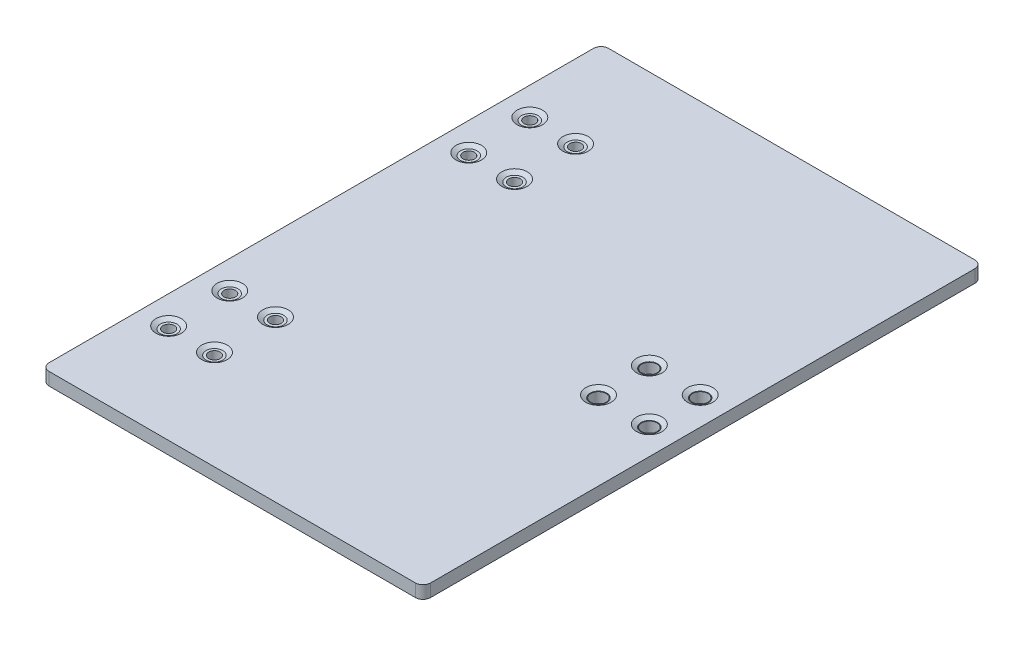
ISO-10303-21;
HEADER;
FILE_DESCRIPTION(('STEP AP214'),'2;1');
FILE_NAME('part.step','',(''),(''),'','','');
FILE_SCHEMA(('AUTOMOTIVE_DESIGN { 1 0 10303 214 1 1 1 1 }'));
ENDSEC;
DATA;
#1=APPLICATION_CONTEXT('core data for automotive mechanical design processes');
#2=APPLICATION_PROTOCOL_DEFINITION('international standard','automotive_design',2000,#1);
#3=PRODUCT_CONTEXT('',#1,'mechanical');
#4=PRODUCT('Part','Part','',(#3));
#5=PRODUCT_RELATED_PRODUCT_CATEGORY('part','',(#4));
#6=PRODUCT_DEFINITION_FORMATION('','',#4);
#7=PRODUCT_DEFINITION_CONTEXT('part definition',#1,'design');
#8=PRODUCT_DEFINITION('design','',#6,#7);
#9=PRODUCT_DEFINITION_SHAPE('','',#8);
#10=(LENGTH_UNIT() NAMED_UNIT(*) SI_UNIT(.MILLI.,.METRE.));
#11=(NAMED_UNIT(*) PLANE_ANGLE_UNIT() SI_UNIT($,.RADIAN.));
#12=(NAMED_UNIT(*) SI_UNIT($,.STERADIAN.) SOLID_ANGLE_UNIT());
#13=UNCERTAINTY_MEASURE_WITH_UNIT(LENGTH_MEASURE(1.E-05),#10,'distance_accuracy_value','');
#14=(GEOMETRIC_REPRESENTATION_CONTEXT(3) GLOBAL_UNCERTAINTY_ASSIGNED_CONTEXT((#13)) GLOBAL_UNIT_ASSIGNED_CONTEXT((#10,
#11,#12)) REPRESENTATION_CONTEXT('',''));
#15=CARTESIAN_POINT('',(0.,0.,0.));
#16=DIRECTION('',(0.,0.,1.));
#17=DIRECTION('',(1.,0.,0.));
#18=AXIS2_PLACEMENT_3D('',#15,#16,#17);
#19=CARTESIAN_POINT('',(11.,-10.,-156.999999999996));
#20=DIRECTION('',(0.,1.,0.));
#21=DIRECTION('',(0.,0.,1.));
#22=AXIS2_PLACEMENT_3D('',#19,#20,#21);
#23=CYLINDRICAL_SURFACE('',#22,2.25);
#24=CARTESIAN_POINT('',(11.,-5.,-156.999999999996));
#25=DIRECTION('',(0.,1.,0.));
#26=DIRECTION('',(0.,0.,1.));
#27=AXIS2_PLACEMENT_3D('',#24,#25,#26);
#28=CIRCLE('',#27,2.25);
#29=CARTESIAN_POINT('',(11.,-5.,-154.749999999996));
#30=VERTEX_POINT('',#29);
#31=EDGE_CURVE('E211',#30,#30,#28,.T.);
#32=ORIENTED_EDGE('',*,*,#31,.F.);
#33=EDGE_LOOP('',(#32));
#34=FACE_BOUND('',#33,.T.);
#35=CARTESIAN_POINT('',(11.,-0.999999999999999,-156.999999999996));
#36=DIRECTION('',(0.,1.,0.));
#37=DIRECTION('',(0.,0.,1.));
#38=AXIS2_PLACEMENT_3D('',#35,#36,#37);
#39=CIRCLE('',#38,2.25);
#40=CARTESIAN_POINT('',(11.,-0.999999999999999,-154.749999999996));
#41=VERTEX_POINT('',#40);
#42=EDGE_CURVE('E139',#41,#41,#39,.F.);
#43=ORIENTED_EDGE('',*,*,#42,.F.);
#44=EDGE_LOOP('',(#43));
#45=FACE_BOUND('',#44,.T.);
#46=ADVANCED_FACE('F38',(#34,#45),#23,.F.);
#47=CARTESIAN_POINT('',(139.,-10.,-120.));
#48=DIRECTION('',(0.,1.,0.));
#49=DIRECTION('',(0.,0.,1.));
#50=AXIS2_PLACEMENT_3D('',#47,#48,#49);
#51=CYLINDRICAL_SURFACE('',#50,2.99999999999999);
#52=CARTESIAN_POINT('',(139.,-5.,-120.));
#53=DIRECTION('',(0.,1.,0.));
#54=DIRECTION('',(0.,0.,1.));
#55=AXIS2_PLACEMENT_3D('',#52,#53,#54);
#56=CIRCLE('',#55,2.99999999999999);
#57=CARTESIAN_POINT('',(139.,-5.,-117.));
#58=VERTEX_POINT('',#57);
#59=EDGE_CURVE('E215',#58,#58,#56,.T.);
#60=ORIENTED_EDGE('',*,*,#59,.F.);
#61=EDGE_LOOP('',(#60));
#62=FACE_BOUND('',#61,.T.);
#63=CARTESIAN_POINT('',(139.,-0.999999999999999,-120.));
#64=DIRECTION('',(0.,1.,0.));
#65=DIRECTION('',(0.,0.,1.));
#66=AXIS2_PLACEMENT_3D('',#63,#64,#65);
#67=CIRCLE('',#66,2.99999999999999);
#68=CARTESIAN_POINT('',(139.,-0.999999999999999,-117.));
#69=VERTEX_POINT('',#68);
#70=EDGE_CURVE('E206',#69,#69,#67,.F.);
#71=ORIENTED_EDGE('',*,*,#70,.F.);
#72=EDGE_LOOP('',(#71));
#73=FACE_BOUND('',#72,.T.);
#74=ADVANCED_FACE('F270',(#62,#73),#51,.F.);
#75=CARTESIAN_POINT('',(119.,-10.,-100.));
#76=DIRECTION('',(0.,1.,0.));
#77=DIRECTION('',(0.,0.,1.));
#78=AXIS2_PLACEMENT_3D('',#75,#76,#77);
#79=CYLINDRICAL_SURFACE('',#78,3.00000000000001);
#80=CARTESIAN_POINT('',(119.,-5.,-100.));
#81=DIRECTION('',(0.,1.,0.));
#82=DIRECTION('',(0.,0.,1.));
#83=AXIS2_PLACEMENT_3D('',#80,#81,#82);
#84=CIRCLE('',#83,3.00000000000001);
#85=CARTESIAN_POINT('',(119.,-5.,-97.));
#86=VERTEX_POINT('',#85);
#87=EDGE_CURVE('E220',#86,#86,#84,.T.);
#88=ORIENTED_EDGE('',*,*,#87,.F.);
#89=EDGE_LOOP('',(#88));
#90=FACE_BOUND('',#89,.T.);
#91=CARTESIAN_POINT('',(119.,-0.999999999999999,-100.));
#92=DIRECTION('',(0.,1.,0.));
#93=DIRECTION('',(0.,0.,1.));
#94=AXIS2_PLACEMENT_3D('',#91,#92,#93);
#95=CIRCLE('',#94,3.00000000000001);
#96=CARTESIAN_POINT('',(119.,-0.999999999999999,-97.));
#97=VERTEX_POINT('',#96);
#98=EDGE_CURVE('E204',#97,#97,#95,.F.);
#99=ORIENTED_EDGE('',*,*,#98,.F.);
#100=EDGE_LOOP('',(#99));
#101=FACE_BOUND('',#100,.T.);
#102=ADVANCED_FACE('F276',(#90,#101),#79,.F.);
#103=CARTESIAN_POINT('',(139.,-10.,-100.));
#104=DIRECTION('',(0.,1.,0.));
#105=DIRECTION('',(0.,0.,1.));
#106=AXIS2_PLACEMENT_3D('',#103,#104,#105);
#107=CYLINDRICAL_SURFACE('',#106,2.99999999999999);
#108=CARTESIAN_POINT('',(139.,-5.,-100.));
#109=DIRECTION('',(0.,1.,0.));
#110=DIRECTION('',(0.,0.,1.));
#111=AXIS2_PLACEMENT_3D('',#108,#109,#110);
#112=CIRCLE('',#111,2.99999999999999);
#113=CARTESIAN_POINT('',(139.,-5.,-97.));
#114=VERTEX_POINT('',#113);
#115=EDGE_CURVE('E227',#114,#114,#112,.T.);
#116=ORIENTED_EDGE('',*,*,#115,.F.);
#117=EDGE_LOOP('',(#116));
#118=FACE_BOUND('',#117,.T.);
#119=CARTESIAN_POINT('',(139.,-0.999999999999999,-100.));
#120=DIRECTION('',(0.,1.,0.));
#121=DIRECTION('',(0.,0.,1.));
#122=AXIS2_PLACEMENT_3D('',#119,#120,#121);
#123=CIRCLE('',#122,2.99999999999999);
#124=CARTESIAN_POINT('',(139.,-0.999999999999999,-97.));
#125=VERTEX_POINT('',#124);
#126=EDGE_CURVE('E201',#125,#125,#123,.F.);
#127=ORIENTED_EDGE('',*,*,#126,.F.);
#128=EDGE_LOOP('',(#127));
#129=FACE_BOUND('',#128,.T.);
#130=ADVANCED_FACE('F560',(#118,#129),#107,.F.);
#131=CARTESIAN_POINT('',(11.,-10.,-63.));
#132=DIRECTION('',(0.,1.,0.));
#133=DIRECTION('',(0.,0.,1.));
#134=AXIS2_PLACEMENT_3D('',#131,#132,#133);
#135=CYLINDRICAL_SURFACE('',#134,2.25);
#136=CARTESIAN_POINT('',(11.,-5.,-63.));
#137=DIRECTION('',(0.,1.,0.));
#138=DIRECTION('',(0.,0.,1.));
#139=AXIS2_PLACEMENT_3D('',#136,#137,#138);
#140=CIRCLE('',#139,2.25);
#141=CARTESIAN_POINT('',(11.,-5.,-60.75));
#142=VERTEX_POINT('',#141);
#143=EDGE_CURVE('E230',#142,#142,#140,.T.);
#144=ORIENTED_EDGE('',*,*,#143,.F.);
#145=EDGE_LOOP('',(#144));
#146=FACE_BOUND('',#145,.T.);
#147=CARTESIAN_POINT('',(11.,-0.999999999999999,-63.));
#148=DIRECTION('',(0.,1.,0.));
#149=DIRECTION('',(0.,0.,1.));
#150=AXIS2_PLACEMENT_3D('',#147,#148,#149);
#151=CIRCLE('',#150,2.25);
#152=CARTESIAN_POINT('',(11.,-0.999999999999999,-60.75));
#153=VERTEX_POINT('',#152);
#154=EDGE_CURVE('E198',#153,#153,#151,.F.);
#155=ORIENTED_EDGE('',*,*,#154,.F.);
#156=EDGE_LOOP('',(#155));
#157=FACE_BOUND('',#156,.T.);
#158=ADVANCED_FACE('F569',(#146,#157),#135,.F.);
#159=CARTESIAN_POINT('',(29.,-10.,-180.999999999996));
#160=DIRECTION('',(0.,1.,0.));
#161=DIRECTION('',(0.,0.,1.));
#162=AXIS2_PLACEMENT_3D('',#159,#160,#161);
#163=CYLINDRICAL_SURFACE('',#162,2.25);
#164=CARTESIAN_POINT('',(29.,-5.,-180.999999999996));
#165=DIRECTION('',(0.,1.,0.));
#166=DIRECTION('',(0.,0.,1.));
#167=AXIS2_PLACEMENT_3D('',#164,#165,#166);
#168=CIRCLE('',#167,2.25);
#169=CARTESIAN_POINT('',(29.,-5.,-178.749999999996));
#170=VERTEX_POINT('',#169);
#171=EDGE_CURVE('E233',#170,#170,#168,.T.);
#172=ORIENTED_EDGE('',*,*,#171,.F.);
#173=EDGE_LOOP('',(#172));
#174=FACE_BOUND('',#173,.T.);
#175=CARTESIAN_POINT('',(29.,-0.999999999999999,-180.999999999996));
#176=DIRECTION('',(0.,1.,0.));
#177=DIRECTION('',(0.,0.,1.));
#178=AXIS2_PLACEMENT_3D('',#175,#176,#177);
#179=CIRCLE('',#178,2.25);
#180=CARTESIAN_POINT('',(29.,-0.999999999999999,-178.749999999996));
#181=VERTEX_POINT('',#180);
#182=EDGE_CURVE('E195',#181,#181,#179,.F.);
#183=ORIENTED_EDGE('',*,*,#182,.F.);
#184=EDGE_LOOP('',(#183));
#185=FACE_BOUND('',#184,.T.);
#186=ADVANCED_FACE('F578',(#174,#185),#163,.F.);
#187=CARTESIAN_POINT('',(29.,-10.,-156.999999999996));
#188=DIRECTION('',(0.,1.,0.));
#189=DIRECTION('',(0.,0.,1.));
#190=AXIS2_PLACEMENT_3D('',#187,#188,#189);
#191=CYLINDRICAL_SURFACE('',#190,2.25);
#192=CARTESIAN_POINT('',(29.,-5.,-156.999999999996));
#193=DIRECTION('',(0.,1.,0.));
#194=DIRECTION('',(0.,0.,1.));
#195=AXIS2_PLACEMENT_3D('',#192,#193,#194);
#196=CIRCLE('',#195,2.25);
#197=CARTESIAN_POINT('',(29.,-5.,-154.749999999996));
#198=VERTEX_POINT('',#197);
#199=EDGE_CURVE('E236',#198,#198,#196,.T.);
#200=ORIENTED_EDGE('',*,*,#199,.F.);
#201=EDGE_LOOP('',(#200));
#202=FACE_BOUND('',#201,.T.);
#203=CARTESIAN_POINT('',(29.,-0.999999999999999,-156.999999999996));
#204=DIRECTION('',(0.,1.,0.));
#205=DIRECTION('',(0.,0.,1.));
#206=AXIS2_PLACEMENT_3D('',#203,#204,#205);
#207=CIRCLE('',#206,2.25);
#208=CARTESIAN_POINT('',(29.,-0.999999999999999,-154.749999999996));
#209=VERTEX_POINT('',#208);
#210=EDGE_CURVE('E192',#209,#209,#207,.F.);
#211=ORIENTED_EDGE('',*,*,#210,.F.);
#212=EDGE_LOOP('',(#211));
#213=FACE_BOUND('',#212,.T.);
#214=ADVANCED_FACE('F282',(#202,#213),#191,.F.);
#215=CARTESIAN_POINT('',(11.,-10.,-180.999999999996));
#216=DIRECTION('',(0.,1.,0.));
#217=DIRECTION('',(0.,0.,1.));
#218=AXIS2_PLACEMENT_3D('',#215,#216,#217);
#219=CYLINDRICAL_SURFACE('',#218,2.25);
#220=CARTESIAN_POINT('',(11.,-5.,-180.999999999996));
#221=DIRECTION('',(0.,1.,0.));
#222=DIRECTION('',(0.,0.,1.));
#223=AXIS2_PLACEMENT_3D('',#220,#221,#222);
#224=CIRCLE('',#223,2.25);
#225=CARTESIAN_POINT('',(11.,-5.,-178.749999999996));
#226=VERTEX_POINT('',#225);
#227=EDGE_CURVE('E239',#226,#226,#224,.T.);
#228=ORIENTED_EDGE('',*,*,#227,.F.);
#229=EDGE_LOOP('',(#228));
#230=FACE_BOUND('',#229,.T.);
#231=CARTESIAN_POINT('',(11.,-0.999999999999999,-180.999999999996));
#232=DIRECTION('',(0.,1.,0.));
#233=DIRECTION('',(0.,0.,1.));
#234=AXIS2_PLACEMENT_3D('',#231,#232,#233);
#235=CIRCLE('',#234,2.25);
#236=CARTESIAN_POINT('',(11.,-0.999999999999999,-178.749999999996));
#237=VERTEX_POINT('',#236);
#238=EDGE_CURVE('E189',#237,#237,#235,.F.);
#239=ORIENTED_EDGE('',*,*,#238,.F.);
#240=EDGE_LOOP('',(#239));
#241=FACE_BOUND('',#240,.T.);
#242=ADVANCED_FACE('F595',(#230,#241),#219,.F.);
#243=CARTESIAN_POINT('',(119.,-10.,-120.));
#244=DIRECTION('',(0.,1.,0.));
#245=DIRECTION('',(0.,0.,1.));
#246=AXIS2_PLACEMENT_3D('',#243,#244,#245);
#247=CYLINDRICAL_SURFACE('',#246,3.00000000000001);
#248=CARTESIAN_POINT('',(119.,-5.,-120.));
#249=DIRECTION('',(0.,1.,0.));
#250=DIRECTION('',(0.,0.,1.));
#251=AXIS2_PLACEMENT_3D('',#248,#249,#250);
#252=CIRCLE('',#251,3.00000000000001);
#253=CARTESIAN_POINT('',(119.,-5.,-117.));
#254=VERTEX_POINT('',#253);
#255=EDGE_CURVE('E242',#254,#254,#252,.T.);
#256=ORIENTED_EDGE('',*,*,#255,.F.);
#257=EDGE_LOOP('',(#256));
#258=FACE_BOUND('',#257,.T.);
#259=CARTESIAN_POINT('',(119.,-0.999999999999999,-120.));
#260=DIRECTION('',(0.,1.,0.));
#261=DIRECTION('',(0.,0.,1.));
#262=AXIS2_PLACEMENT_3D('',#259,#260,#261);
#263=CIRCLE('',#262,3.00000000000001);
#264=CARTESIAN_POINT('',(119.,-0.999999999999999,-117.));
#265=VERTEX_POINT('',#264);
#266=EDGE_CURVE('E186',#265,#265,#263,.F.);
#267=ORIENTED_EDGE('',*,*,#266,.F.);
#268=EDGE_LOOP('',(#267));
#269=FACE_BOUND('',#268,.T.);
#270=ADVANCED_FACE('F603',(#258,#269),#247,.F.);
#271=CARTESIAN_POINT('',(29.,-10.,-39.));
#272=DIRECTION('',(0.,1.,0.));
#273=DIRECTION('',(0.,0.,1.));
#274=AXIS2_PLACEMENT_3D('',#271,#272,#273);
#275=CYLINDRICAL_SURFACE('',#274,2.25);
#276=CARTESIAN_POINT('',(29.,-5.,-39.));
#277=DIRECTION('',(0.,1.,0.));
#278=DIRECTION('',(0.,0.,1.));
#279=AXIS2_PLACEMENT_3D('',#276,#277,#278);
#280=CIRCLE('',#279,2.25);
#281=CARTESIAN_POINT('',(29.,-5.,-36.75));
#282=VERTEX_POINT('',#281);
#283=EDGE_CURVE('E245',#282,#282,#280,.T.);
#284=ORIENTED_EDGE('',*,*,#283,.F.);
#285=EDGE_LOOP('',(#284));
#286=FACE_BOUND('',#285,.T.);
#287=CARTESIAN_POINT('',(29.,-0.999999999999999,-39.));
#288=DIRECTION('',(0.,1.,0.));
#289=DIRECTION('',(0.,0.,1.));
#290=AXIS2_PLACEMENT_3D('',#287,#288,#289);
#291=CIRCLE('',#290,2.25);
#292=CARTESIAN_POINT('',(29.,-0.999999999999999,-36.75));
#293=VERTEX_POINT('',#292);
#294=EDGE_CURVE('E183',#293,#293,#291,.F.);
#295=ORIENTED_EDGE('',*,*,#294,.F.);
#296=EDGE_LOOP('',(#295));
#297=FACE_BOUND('',#296,.T.);
#298=ADVANCED_FACE('F611',(#286,#297),#275,.F.);
#299=CARTESIAN_POINT('',(11.,-10.,-39.));
#300=DIRECTION('',(0.,1.,0.));
#301=DIRECTION('',(0.,0.,1.));
#302=AXIS2_PLACEMENT_3D('',#299,#300,#301);
#303=CYLINDRICAL_SURFACE('',#302,2.25);
#304=CARTESIAN_POINT('',(11.,-5.,-39.));
#305=DIRECTION('',(0.,1.,0.));
#306=DIRECTION('',(0.,0.,1.));
#307=AXIS2_PLACEMENT_3D('',#304,#305,#306);
#308=CIRCLE('',#307,2.25);
#309=CARTESIAN_POINT('',(11.,-5.,-36.75));
#310=VERTEX_POINT('',#309);
#311=EDGE_CURVE('E248',#310,#310,#308,.T.);
#312=ORIENTED_EDGE('',*,*,#311,.F.);
#313=EDGE_LOOP('',(#312));
#314=FACE_BOUND('',#313,.T.);
#315=CARTESIAN_POINT('',(11.,-0.999999999999999,-39.));
#316=DIRECTION('',(0.,1.,0.));
#317=DIRECTION('',(0.,0.,1.));
#318=AXIS2_PLACEMENT_3D('',#315,#316,#317);
#319=CIRCLE('',#318,2.25);
#320=CARTESIAN_POINT('',(11.,-0.999999999999999,-36.75));
#321=VERTEX_POINT('',#320);
#322=EDGE_CURVE('E179',#321,#321,#319,.F.);
#323=ORIENTED_EDGE('',*,*,#322,.F.);
#324=EDGE_LOOP('',(#323));
#325=FACE_BOUND('',#324,.T.);
#326=ADVANCED_FACE('F620',(#314,#325),#303,.F.);
#327=CARTESIAN_POINT('',(29.,-10.,-63.));
#328=DIRECTION('',(0.,1.,0.));
#329=DIRECTION('',(0.,0.,1.));
#330=AXIS2_PLACEMENT_3D('',#327,#328,#329);
#331=CYLINDRICAL_SURFACE('',#330,2.25);
#332=CARTESIAN_POINT('',(29.,-5.,-63.));
#333=DIRECTION('',(0.,1.,0.));
#334=DIRECTION('',(0.,0.,1.));
#335=AXIS2_PLACEMENT_3D('',#332,#333,#334);
#336=CIRCLE('',#335,2.25);
#337=CARTESIAN_POINT('',(29.,-5.,-60.75));
#338=VERTEX_POINT('',#337);
#339=EDGE_CURVE('E126',#338,#338,#336,.T.);
#340=ORIENTED_EDGE('',*,*,#339,.F.);
#341=EDGE_LOOP('',(#340));
#342=FACE_BOUND('',#341,.T.);
#343=CARTESIAN_POINT('',(29.,-0.999999999999999,-63.));
#344=DIRECTION('',(0.,1.,0.));
#345=DIRECTION('',(0.,0.,1.));
#346=AXIS2_PLACEMENT_3D('',#343,#344,#345);
#347=CIRCLE('',#346,2.25);
#348=CARTESIAN_POINT('',(29.,-0.999999999999999,-60.75));
#349=VERTEX_POINT('',#348);
#350=EDGE_CURVE('E176',#349,#349,#347,.F.);
#351=ORIENTED_EDGE('',*,*,#350,.F.);
#352=EDGE_LOOP('',(#351));
#353=FACE_BOUND('',#352,.T.);
#354=ADVANCED_FACE('F299',(#342,#353),#331,.F.);
#355=CARTESIAN_POINT('',(150.,-5.,-220.));
#356=DIRECTION('',(0.,0.,-1.));
#357=DIRECTION('',(-1.,0.,0.));
#358=AXIS2_PLACEMENT_3D('',#355,#356,#357);
#359=PLANE('',#358);
#360=DIRECTION('',(-1.,0.,0.));
#361=VECTOR('',#360,1.);
#362=CARTESIAN_POINT('',(150.,-5.,-220.));
#363=LINE('',#362,#361);
#364=CARTESIAN_POINT('',(147.,-5.,-220.));
#365=VERTEX_POINT('',#364);
#366=CARTESIAN_POINT('',(2.99999999999998,-5.,-220.));
#367=VERTEX_POINT('',#366);
#368=EDGE_CURVE('E172',#365,#367,#363,.T.);
#369=ORIENTED_EDGE('',*,*,#368,.T.);
#370=DIRECTION('',(0.,1.,0.));
#371=VECTOR('',#370,1.);
#372=CARTESIAN_POINT('',(2.99999999999998,-5.,-220.));
#373=LINE('',#372,#371);
#374=CARTESIAN_POINT('',(2.99999999999998,0.,-220.));
#375=VERTEX_POINT('',#374);
#376=EDGE_CURVE('E124',#367,#375,#373,.T.);
#377=ORIENTED_EDGE('',*,*,#376,.T.);
#378=DIRECTION('',(-1.,0.,0.));
#379=VECTOR('',#378,1.);
#380=CARTESIAN_POINT('',(150.,0.,-220.));
#381=LINE('',#380,#379);
#382=CARTESIAN_POINT('',(147.,0.,-220.));
#383=VERTEX_POINT('',#382);
#384=EDGE_CURVE('E107',#383,#375,#381,.T.);
#385=ORIENTED_EDGE('',*,*,#384,.F.);
#386=DIRECTION('',(0.,1.,0.));
#387=VECTOR('',#386,1.);
#388=CARTESIAN_POINT('',(147.,-5.,-220.));
#389=LINE('',#388,#387);
#390=EDGE_CURVE('E121',#383,#365,#389,.F.);
#391=ORIENTED_EDGE('',*,*,#390,.T.);
#392=EDGE_LOOP('',(#369,#377,#385,#391));
#393=FACE_BOUND('',#392,.T.);
#394=ADVANCED_FACE('F120',(#393),#359,.T.);
#395=CARTESIAN_POINT('',(150.,-5.,0.));
#396=DIRECTION('',(1.,0.,0.));
#397=DIRECTION('',(0.,0.,-1.));
#398=AXIS2_PLACEMENT_3D('',#395,#396,#397);
#399=PLANE('',#398);
#400=DIRECTION('',(0.,0.,-1.));
#401=VECTOR('',#400,1.);
#402=CARTESIAN_POINT('',(150.,-5.,0.));
#403=LINE('',#402,#401);
#404=CARTESIAN_POINT('',(150.,-5.,-3.));
#405=VERTEX_POINT('',#404);
#406=CARTESIAN_POINT('',(150.,-5.,-217.));
#407=VERTEX_POINT('',#406);
#408=EDGE_CURVE('E131',#405,#407,#403,.T.);
#409=ORIENTED_EDGE('',*,*,#408,.T.);
#410=DIRECTION('',(0.,1.,0.));
#411=VECTOR('',#410,1.);
#412=CARTESIAN_POINT('',(150.,-5.,-217.));
#413=LINE('',#412,#411);
#414=CARTESIAN_POINT('',(150.,0.,-217.));
#415=VERTEX_POINT('',#414);
#416=EDGE_CURVE('E158',#407,#415,#413,.T.);
#417=ORIENTED_EDGE('',*,*,#416,.T.);
#418=DIRECTION('',(0.,0.,-1.));
#419=VECTOR('',#418,1.);
#420=CARTESIAN_POINT('',(150.,0.,0.));
#421=LINE('',#420,#419);
#422=CARTESIAN_POINT('',(150.,0.,-3.));
#423=VERTEX_POINT('',#422);
#424=EDGE_CURVE('E109',#423,#415,#421,.T.);
#425=ORIENTED_EDGE('',*,*,#424,.F.);
#426=DIRECTION('',(0.,1.,0.));
#427=VECTOR('',#426,1.);
#428=CARTESIAN_POINT('',(150.,-5.,-3.));
#429=LINE('',#428,#427);
#430=EDGE_CURVE('E156',#423,#405,#429,.F.);
#431=ORIENTED_EDGE('',*,*,#430,.T.);
#432=EDGE_LOOP('',(#409,#417,#425,#431));
#433=FACE_BOUND('',#432,.T.);
#434=ADVANCED_FACE('F160',(#433),#399,.T.);
#435=CARTESIAN_POINT('',(0.,-5.,0.));
#436=DIRECTION('',(0.,0.,1.));
#437=DIRECTION('',(1.,0.,0.));
#438=AXIS2_PLACEMENT_3D('',#435,#436,#437);
#439=PLANE('',#438);
#440=DIRECTION('',(1.,0.,0.));
#441=VECTOR('',#440,1.);
#442=CARTESIAN_POINT('',(0.,-5.,0.));
#443=LINE('',#442,#441);
#444=CARTESIAN_POINT('',(3.,-5.,0.));
#445=VERTEX_POINT('',#444);
#446=CARTESIAN_POINT('',(147.,-5.,0.));
#447=VERTEX_POINT('',#446);
#448=EDGE_CURVE('E136',#445,#447,#443,.T.);
#449=ORIENTED_EDGE('',*,*,#448,.T.);
#450=DIRECTION('',(0.,1.,0.));
#451=VECTOR('',#450,1.);
#452=CARTESIAN_POINT('',(147.,-5.,0.));
#453=LINE('',#452,#451);
#454=CARTESIAN_POINT('',(147.,0.,0.));
#455=VERTEX_POINT('',#454);
#456=EDGE_CURVE('E11',#447,#455,#453,.T.);
#457=ORIENTED_EDGE('',*,*,#456,.T.);
#458=DIRECTION('',(1.,0.,0.));
#459=VECTOR('',#458,1.);
#460=CARTESIAN_POINT('',(0.,0.,0.));
#461=LINE('',#460,#459);
#462=CARTESIAN_POINT('',(3.,0.,0.));
#463=VERTEX_POINT('',#462);
#464=EDGE_CURVE('E169',#463,#455,#461,.T.);
#465=ORIENTED_EDGE('',*,*,#464,.F.);
#466=DIRECTION('',(0.,1.,0.));
#467=VECTOR('',#466,1.);
#468=CARTESIAN_POINT('',(3.,-5.,0.));
#469=LINE('',#468,#467);
#470=EDGE_CURVE('E46',#463,#445,#469,.F.);
#471=ORIENTED_EDGE('',*,*,#470,.T.);
#472=EDGE_LOOP('',(#449,#457,#465,#471));
#473=FACE_BOUND('',#472,.T.);
#474=ADVANCED_FACE('F168',(#473),#439,.T.);
#475=CARTESIAN_POINT('',(0.,-5.,-220.));
#476=DIRECTION('',(-1.,0.,0.));
#477=DIRECTION('',(0.,0.,1.));
#478=AXIS2_PLACEMENT_3D('',#475,#476,#477);
#479=PLANE('',#478);
#480=DIRECTION('',(0.,0.,1.));
#481=VECTOR('',#480,1.);
#482=CARTESIAN_POINT('',(0.,0.,-220.));
#483=LINE('',#482,#481);
#484=CARTESIAN_POINT('',(0.,0.,-217.));
#485=VERTEX_POINT('',#484);
#486=CARTESIAN_POINT('',(0.,0.,-3.));
#487=VERTEX_POINT('',#486);
#488=EDGE_CURVE('E125',#485,#487,#483,.T.);
#489=ORIENTED_EDGE('',*,*,#488,.F.);
#490=DIRECTION('',(0.,1.,0.));
#491=VECTOR('',#490,1.);
#492=CARTESIAN_POINT('',(0.,-5.,-217.));
#493=LINE('',#492,#491);
#494=CARTESIAN_POINT('',(0.,-5.,-217.));
#495=VERTEX_POINT('',#494);
#496=EDGE_CURVE('E148',#485,#495,#493,.F.);
#497=ORIENTED_EDGE('',*,*,#496,.T.);
#498=DIRECTION('',(0.,0.,1.));
#499=VECTOR('',#498,1.);
#500=CARTESIAN_POINT('',(0.,-5.,-220.));
#501=LINE('',#500,#499);
#502=CARTESIAN_POINT('',(0.,-5.,-3.));
#503=VERTEX_POINT('',#502);
#504=EDGE_CURVE('E254',#495,#503,#501,.T.);
#505=ORIENTED_EDGE('',*,*,#504,.T.);
#506=DIRECTION('',(0.,1.,0.));
#507=VECTOR('',#506,1.);
#508=CARTESIAN_POINT('',(0.,-5.,-3.));
#509=LINE('',#508,#507);
#510=EDGE_CURVE('E145',#503,#487,#509,.T.);
#511=ORIENTED_EDGE('',*,*,#510,.T.);
#512=EDGE_LOOP('',(#489,#497,#505,#511));
#513=FACE_BOUND('',#512,.T.);
#514=ADVANCED_FACE('F260',(#513),#479,.T.);
#515=CARTESIAN_POINT('',(0.,-5.,0.));
#516=DIRECTION('',(0.,1.,0.));
#517=DIRECTION('',(0.,0.,1.));
#518=AXIS2_PLACEMENT_3D('',#515,#516,#517);
#519=PLANE('',#518);
#520=ORIENTED_EDGE('',*,*,#339,.T.);
#521=EDGE_LOOP('',(#520));
#522=FACE_BOUND('',#521,.T.);
#523=ORIENTED_EDGE('',*,*,#311,.T.);
#524=EDGE_LOOP('',(#523));
#525=FACE_BOUND('',#524,.T.);
#526=ORIENTED_EDGE('',*,*,#283,.T.);
#527=EDGE_LOOP('',(#526));
#528=FACE_BOUND('',#527,.T.);
#529=ORIENTED_EDGE('',*,*,#255,.T.);
#530=EDGE_LOOP('',(#529));
#531=FACE_BOUND('',#530,.T.);
#532=ORIENTED_EDGE('',*,*,#227,.T.);
#533=EDGE_LOOP('',(#532));
#534=FACE_BOUND('',#533,.T.);
#535=ORIENTED_EDGE('',*,*,#199,.T.);
#536=EDGE_LOOP('',(#535));
#537=FACE_BOUND('',#536,.T.);
#538=ORIENTED_EDGE('',*,*,#171,.T.);
#539=EDGE_LOOP('',(#538));
#540=FACE_BOUND('',#539,.T.);
#541=ORIENTED_EDGE('',*,*,#143,.T.);
#542=EDGE_LOOP('',(#541));
#543=FACE_BOUND('',#542,.T.);
#544=ORIENTED_EDGE('',*,*,#115,.T.);
#545=EDGE_LOOP('',(#544));
#546=FACE_BOUND('',#545,.T.);
#547=ORIENTED_EDGE('',*,*,#87,.T.);
#548=EDGE_LOOP('',(#547));
#549=FACE_BOUND('',#548,.T.);
#550=ORIENTED_EDGE('',*,*,#59,.T.);
#551=EDGE_LOOP('',(#550));
#552=FACE_BOUND('',#551,.T.);
#553=ORIENTED_EDGE('',*,*,#31,.T.);
#554=EDGE_LOOP('',(#553));
#555=FACE_BOUND('',#554,.T.);
#556=ORIENTED_EDGE('',*,*,#504,.F.);
#557=CARTESIAN_POINT('',(2.99999999999998,-5.,-217.));
#558=DIRECTION('',(0.,1.,0.));
#559=DIRECTION('',(0.,0.,1.));
#560=AXIS2_PLACEMENT_3D('',#557,#558,#559);
#561=CIRCLE('',#560,3.);
#562=EDGE_CURVE('E154',#495,#367,#561,.F.);
#563=ORIENTED_EDGE('',*,*,#562,.T.);
#564=ORIENTED_EDGE('',*,*,#368,.F.);
#565=CARTESIAN_POINT('',(147.,-5.,-217.));
#566=DIRECTION('',(0.,1.,0.));
#567=DIRECTION('',(0.,0.,1.));
#568=AXIS2_PLACEMENT_3D('',#565,#566,#567);
#569=CIRCLE('',#568,3.);
#570=EDGE_CURVE('E130',#365,#407,#569,.F.);
#571=ORIENTED_EDGE('',*,*,#570,.T.);
#572=ORIENTED_EDGE('',*,*,#408,.F.);
#573=CARTESIAN_POINT('',(147.,-5.,-3.));
#574=DIRECTION('',(0.,1.,0.));
#575=DIRECTION('',(0.,0.,1.));
#576=AXIS2_PLACEMENT_3D('',#573,#574,#575);
#577=CIRCLE('',#576,3.);
#578=EDGE_CURVE('E53',#405,#447,#577,.F.);
#579=ORIENTED_EDGE('',*,*,#578,.T.);
#580=ORIENTED_EDGE('',*,*,#448,.F.);
#581=CARTESIAN_POINT('',(3.,-5.,-3.));
#582=DIRECTION('',(0.,1.,0.));
#583=DIRECTION('',(0.,0.,1.));
#584=AXIS2_PLACEMENT_3D('',#581,#582,#583);
#585=CIRCLE('',#584,3.);
#586=EDGE_CURVE('E150',#445,#503,#585,.F.);
#587=ORIENTED_EDGE('',*,*,#586,.T.);
#588=EDGE_LOOP('',(#556,#563,#564,#571,#572,#579,#580,#587));
#589=FACE_BOUND('',#588,.T.);
#590=ADVANCED_FACE('F163',(#522,#525,#528,#531,#534,#537,#540,#543,#546,#549,#552,#555,#589),
#519,.F.);
#591=CARTESIAN_POINT('',(0.,0.,0.));
#592=DIRECTION('',(0.,1.,0.));
#593=DIRECTION('',(0.,0.,1.));
#594=AXIS2_PLACEMENT_3D('',#591,#592,#593);
#595=PLANE('',#594);
#596=CARTESIAN_POINT('',(139.,0.,-120.));
#597=DIRECTION('',(0.,1.,0.));
#598=DIRECTION('',(0.,0.,1.));
#599=AXIS2_PLACEMENT_3D('',#596,#597,#598);
#600=CIRCLE('',#599,4.99999999999999);
#601=CARTESIAN_POINT('',(139.,0.,-115.));
#602=VERTEX_POINT('',#601);
#603=EDGE_CURVE('E773',#602,#602,#600,.T.);
#604=ORIENTED_EDGE('',*,*,#603,.F.);
#605=EDGE_LOOP('',(#604));
#606=FACE_BOUND('',#605,.T.);
#607=CARTESIAN_POINT('',(119.,0.,-100.));
#608=DIRECTION('',(0.,1.,0.));
#609=DIRECTION('',(0.,0.,1.));
#610=AXIS2_PLACEMENT_3D('',#607,#608,#609);
#611=CIRCLE('',#610,5.00000000000001);
#612=CARTESIAN_POINT('',(119.,0.,-95.));
#613=VERTEX_POINT('',#612);
#614=EDGE_CURVE('E781',#613,#613,#611,.T.);
#615=ORIENTED_EDGE('',*,*,#614,.F.);
#616=EDGE_LOOP('',(#615));
#617=FACE_BOUND('',#616,.T.);
#618=CARTESIAN_POINT('',(139.,0.,-100.));
#619=DIRECTION('',(0.,1.,0.));
#620=DIRECTION('',(0.,0.,1.));
#621=AXIS2_PLACEMENT_3D('',#618,#619,#620);
#622=CIRCLE('',#621,4.99999999999999);
#623=CARTESIAN_POINT('',(139.,0.,-95.));
#624=VERTEX_POINT('',#623);
#625=EDGE_CURVE('E762',#624,#624,#622,.T.);
#626=ORIENTED_EDGE('',*,*,#625,.F.);
#627=EDGE_LOOP('',(#626));
#628=FACE_BOUND('',#627,.T.);
#629=CARTESIAN_POINT('',(29.,0.,-63.));
#630=DIRECTION('',(0.,1.,0.));
#631=DIRECTION('',(0.,0.,1.));
#632=AXIS2_PLACEMENT_3D('',#629,#630,#631);
#633=CIRCLE('',#632,5.);
#634=CARTESIAN_POINT('',(29.,0.,-58.));
#635=VERTEX_POINT('',#634);
#636=EDGE_CURVE('E763',#635,#635,#633,.T.);
#637=ORIENTED_EDGE('',*,*,#636,.F.);
#638=EDGE_LOOP('',(#637));
#639=FACE_BOUND('',#638,.T.);
#640=CARTESIAN_POINT('',(29.,0.,-180.999999999996));
#641=DIRECTION('',(0.,1.,0.));
#642=DIRECTION('',(0.,0.,1.));
#643=AXIS2_PLACEMENT_3D('',#640,#641,#642);
#644=CIRCLE('',#643,5.);
#645=CARTESIAN_POINT('',(29.,0.,-175.999999999996));
#646=VERTEX_POINT('',#645);
#647=EDGE_CURVE('E798',#646,#646,#644,.T.);
#648=ORIENTED_EDGE('',*,*,#647,.F.);
#649=EDGE_LOOP('',(#648));
#650=FACE_BOUND('',#649,.T.);
#651=CARTESIAN_POINT('',(11.,0.,-156.999999999996));
#652=DIRECTION('',(0.,1.,0.));
#653=DIRECTION('',(0.,0.,1.));
#654=AXIS2_PLACEMENT_3D('',#651,#652,#653);
#655=CIRCLE('',#654,5.);
#656=CARTESIAN_POINT('',(11.,0.,-151.999999999996));
#657=VERTEX_POINT('',#656);
#658=EDGE_CURVE('E793',#657,#657,#655,.T.);
#659=ORIENTED_EDGE('',*,*,#658,.F.);
#660=EDGE_LOOP('',(#659));
#661=FACE_BOUND('',#660,.T.);
#662=CARTESIAN_POINT('',(29.,0.,-156.999999999996));
#663=DIRECTION('',(0.,1.,0.));
#664=DIRECTION('',(0.,0.,1.));
#665=AXIS2_PLACEMENT_3D('',#662,#663,#664);
#666=CIRCLE('',#665,5.);
#667=CARTESIAN_POINT('',(29.,0.,-151.999999999996));
#668=VERTEX_POINT('',#667);
#669=EDGE_CURVE('E786',#668,#668,#666,.T.);
#670=ORIENTED_EDGE('',*,*,#669,.F.);
#671=EDGE_LOOP('',(#670));
#672=FACE_BOUND('',#671,.T.);
#673=CARTESIAN_POINT('',(119.,0.,-120.));
#674=DIRECTION('',(0.,1.,0.));
#675=DIRECTION('',(0.,0.,1.));
#676=AXIS2_PLACEMENT_3D('',#673,#674,#675);
#677=CIRCLE('',#676,5.00000000000001);
#678=CARTESIAN_POINT('',(119.,0.,-115.));
#679=VERTEX_POINT('',#678);
#680=EDGE_CURVE('E780',#679,#679,#677,.T.);
#681=ORIENTED_EDGE('',*,*,#680,.F.);
#682=EDGE_LOOP('',(#681));
#683=FACE_BOUND('',#682,.T.);
#684=CARTESIAN_POINT('',(11.,0.,-63.));
#685=DIRECTION('',(0.,1.,0.));
#686=DIRECTION('',(0.,0.,1.));
#687=AXIS2_PLACEMENT_3D('',#684,#685,#686);
#688=CIRCLE('',#687,5.);
#689=CARTESIAN_POINT('',(11.,0.,-58.));
#690=VERTEX_POINT('',#689);
#691=EDGE_CURVE('E827',#690,#690,#688,.T.);
#692=ORIENTED_EDGE('',*,*,#691,.F.);
#693=EDGE_LOOP('',(#692));
#694=FACE_BOUND('',#693,.T.);
#695=CARTESIAN_POINT('',(11.,0.,-39.));
#696=DIRECTION('',(0.,1.,0.));
#697=DIRECTION('',(0.,0.,1.));
#698=AXIS2_PLACEMENT_3D('',#695,#696,#697);
#699=CIRCLE('',#698,5.);
#700=CARTESIAN_POINT('',(11.,0.,-34.));
#701=VERTEX_POINT('',#700);
#702=EDGE_CURVE('E831',#701,#701,#699,.T.);
#703=ORIENTED_EDGE('',*,*,#702,.F.);
#704=EDGE_LOOP('',(#703));
#705=FACE_BOUND('',#704,.T.);
#706=CARTESIAN_POINT('',(29.,0.,-39.));
#707=DIRECTION('',(0.,1.,0.));
#708=DIRECTION('',(0.,0.,1.));
#709=AXIS2_PLACEMENT_3D('',#706,#707,#708);
#710=CIRCLE('',#709,5.);
#711=CARTESIAN_POINT('',(29.,0.,-34.));
#712=VERTEX_POINT('',#711);
#713=EDGE_CURVE('E834',#712,#712,#710,.T.);
#714=ORIENTED_EDGE('',*,*,#713,.F.);
#715=EDGE_LOOP('',(#714));
#716=FACE_BOUND('',#715,.T.);
#717=CARTESIAN_POINT('',(11.,0.,-180.999999999996));
#718=DIRECTION('',(0.,1.,0.));
#719=DIRECTION('',(0.,0.,1.));
#720=AXIS2_PLACEMENT_3D('',#717,#718,#719);
#721=CIRCLE('',#720,5.);
#722=CARTESIAN_POINT('',(11.,0.,-175.999999999996));
#723=VERTEX_POINT('',#722);
#724=EDGE_CURVE('E805',#723,#723,#721,.T.);
#725=ORIENTED_EDGE('',*,*,#724,.F.);
#726=EDGE_LOOP('',(#725));
#727=FACE_BOUND('',#726,.T.);
#728=ORIENTED_EDGE('',*,*,#384,.T.);
#729=CARTESIAN_POINT('',(2.99999999999998,0.,-217.));
#730=DIRECTION('',(0.,1.,0.));
#731=DIRECTION('',(0.,0.,1.));
#732=AXIS2_PLACEMENT_3D('',#729,#730,#731);
#733=CIRCLE('',#732,3.);
#734=EDGE_CURVE('E114',#375,#485,#733,.T.);
#735=ORIENTED_EDGE('',*,*,#734,.T.);
#736=ORIENTED_EDGE('',*,*,#488,.T.);
#737=CARTESIAN_POINT('',(3.,0.,-3.));
#738=DIRECTION('',(0.,1.,0.));
#739=DIRECTION('',(0.,0.,1.));
#740=AXIS2_PLACEMENT_3D('',#737,#738,#739);
#741=CIRCLE('',#740,3.);
#742=EDGE_CURVE('E133',#487,#463,#741,.T.);
#743=ORIENTED_EDGE('',*,*,#742,.T.);
#744=ORIENTED_EDGE('',*,*,#464,.T.);
#745=CARTESIAN_POINT('',(147.,0.,-3.));
#746=DIRECTION('',(0.,1.,0.));
#747=DIRECTION('',(0.,0.,1.));
#748=AXIS2_PLACEMENT_3D('',#745,#746,#747);
#749=CIRCLE('',#748,3.);
#750=EDGE_CURVE('E115',#455,#423,#749,.T.);
#751=ORIENTED_EDGE('',*,*,#750,.T.);
#752=ORIENTED_EDGE('',*,*,#424,.T.);
#753=CARTESIAN_POINT('',(147.,0.,-217.));
#754=DIRECTION('',(0.,1.,0.));
#755=DIRECTION('',(0.,0.,1.));
#756=AXIS2_PLACEMENT_3D('',#753,#754,#755);
#757=CIRCLE('',#756,3.);
#758=EDGE_CURVE('E104',#415,#383,#757,.T.);
#759=ORIENTED_EDGE('',*,*,#758,.T.);
#760=EDGE_LOOP('',(#728,#735,#736,#743,#744,#751,#752,#759));
#761=FACE_BOUND('',#760,.T.);
#762=ADVANCED_FACE('F106',(#606,#617,#628,#639,#650,#661,#672,#683,#694,#705,#716,#727,#761),
#595,.T.);
#763=CARTESIAN_POINT('',(29.,-1.,-63.));
#764=DIRECTION('',(0.,1.,0.));
#765=DIRECTION('',(0.,0.,1.));
#766=AXIS2_PLACEMENT_3D('',#763,#764,#765);
#767=PLANE('',#766);
#768=CARTESIAN_POINT('',(29.,-1.,-63.));
#769=DIRECTION('',(0.,1.,0.));
#770=DIRECTION('',(0.,0.,1.));
#771=AXIS2_PLACEMENT_3D('',#768,#769,#770);
#772=CIRCLE('',#771,3.26794919243111);
#773=CARTESIAN_POINT('',(29.,-1.,-59.7320508075689));
#774=VERTEX_POINT('',#773);
#775=EDGE_CURVE('E761',#774,#774,#772,.T.);
#776=ORIENTED_EDGE('',*,*,#775,.T.);
#777=EDGE_LOOP('',(#776));
#778=FACE_BOUND('',#777,.T.);
#779=ORIENTED_EDGE('',*,*,#350,.T.);
#780=EDGE_LOOP('',(#779));
#781=FACE_BOUND('',#780,.T.);
#782=ADVANCED_FACE('F289',(#778,#781),#767,.T.);
#783=CARTESIAN_POINT('',(29.,0.,-63.));
#784=DIRECTION('',(0.,1.,0.));
#785=DIRECTION('',(0.,0.,1.));
#786=AXIS2_PLACEMENT_3D('',#783,#784,#785);
#787=CONICAL_SURFACE('',#786,5.,1.0471975511966);
#788=ORIENTED_EDGE('',*,*,#775,.F.);
#789=EDGE_LOOP('',(#788));
#790=FACE_BOUND('',#789,.T.);
#791=ORIENTED_EDGE('',*,*,#636,.T.);
#792=EDGE_LOOP('',(#791));
#793=FACE_BOUND('',#792,.T.);
#794=ADVANCED_FACE('F525',(#790,#793),#787,.F.);
#795=CARTESIAN_POINT('',(11.,-1.,-39.));
#796=DIRECTION('',(0.,1.,0.));
#797=DIRECTION('',(0.,0.,1.));
#798=AXIS2_PLACEMENT_3D('',#795,#796,#797);
#799=PLANE('',#798);
#800=CARTESIAN_POINT('',(11.,-1.,-39.));
#801=DIRECTION('',(0.,1.,0.));
#802=DIRECTION('',(0.,0.,1.));
#803=AXIS2_PLACEMENT_3D('',#800,#801,#802);
#804=CIRCLE('',#803,3.26794919243111);
#805=CARTESIAN_POINT('',(11.,-1.,-35.7320508075689));
#806=VERTEX_POINT('',#805);
#807=EDGE_CURVE('E841',#806,#806,#804,.T.);
#808=ORIENTED_EDGE('',*,*,#807,.T.);
#809=EDGE_LOOP('',(#808));
#810=FACE_BOUND('',#809,.T.);
#811=ORIENTED_EDGE('',*,*,#322,.T.);
#812=EDGE_LOOP('',(#811));
#813=FACE_BOUND('',#812,.T.);
#814=ADVANCED_FACE('F516',(#810,#813),#799,.T.);
#815=CARTESIAN_POINT('',(11.,0.,-39.));
#816=DIRECTION('',(0.,1.,0.));
#817=DIRECTION('',(0.,0.,1.));
#818=AXIS2_PLACEMENT_3D('',#815,#816,#817);
#819=CONICAL_SURFACE('',#818,5.,1.0471975511966);
#820=ORIENTED_EDGE('',*,*,#807,.F.);
#821=EDGE_LOOP('',(#820));
#822=FACE_BOUND('',#821,.T.);
#823=ORIENTED_EDGE('',*,*,#702,.T.);
#824=EDGE_LOOP('',(#823));
#825=FACE_BOUND('',#824,.T.);
#826=ADVANCED_FACE('F507',(#822,#825),#819,.F.);
#827=CARTESIAN_POINT('',(29.,-1.,-39.));
#828=DIRECTION('',(0.,1.,0.));
#829=DIRECTION('',(0.,0.,1.));
#830=AXIS2_PLACEMENT_3D('',#827,#828,#829);
#831=PLANE('',#830);
#832=CARTESIAN_POINT('',(29.,-1.,-39.));
#833=DIRECTION('',(0.,1.,0.));
#834=DIRECTION('',(0.,0.,1.));
#835=AXIS2_PLACEMENT_3D('',#832,#833,#834);
#836=CIRCLE('',#835,3.26794919243111);
#837=CARTESIAN_POINT('',(29.,-1.,-35.7320508075689));
#838=VERTEX_POINT('',#837);
#839=EDGE_CURVE('E836',#838,#838,#836,.T.);
#840=ORIENTED_EDGE('',*,*,#839,.T.);
#841=EDGE_LOOP('',(#840));
#842=FACE_BOUND('',#841,.T.);
#843=ORIENTED_EDGE('',*,*,#294,.T.);
#844=EDGE_LOOP('',(#843));
#845=FACE_BOUND('',#844,.T.);
#846=ADVANCED_FACE('F498',(#842,#845),#831,.T.);
#847=CARTESIAN_POINT('',(29.,0.,-39.));
#848=DIRECTION('',(0.,1.,0.));
#849=DIRECTION('',(0.,0.,1.));
#850=AXIS2_PLACEMENT_3D('',#847,#848,#849);
#851=CONICAL_SURFACE('',#850,5.,1.0471975511966);
#852=ORIENTED_EDGE('',*,*,#839,.F.);
#853=EDGE_LOOP('',(#852));
#854=FACE_BOUND('',#853,.T.);
#855=ORIENTED_EDGE('',*,*,#713,.T.);
#856=EDGE_LOOP('',(#855));
#857=FACE_BOUND('',#856,.T.);
#858=ADVANCED_FACE('F489',(#854,#857),#851,.F.);
#859=CARTESIAN_POINT('',(119.,-1.,-120.));
#860=DIRECTION('',(0.,1.,0.));
#861=DIRECTION('',(0.,0.,1.));
#862=AXIS2_PLACEMENT_3D('',#859,#860,#861);
#863=PLANE('',#862);
#864=CARTESIAN_POINT('',(119.,-1.,-120.));
#865=DIRECTION('',(0.,1.,0.));
#866=DIRECTION('',(0.,0.,1.));
#867=AXIS2_PLACEMENT_3D('',#864,#865,#866);
#868=CIRCLE('',#867,3.26794919243112);
#869=CARTESIAN_POINT('',(119.,-1.,-116.732050807569));
#870=VERTEX_POINT('',#869);
#871=EDGE_CURVE('E790',#870,#870,#868,.T.);
#872=ORIENTED_EDGE('',*,*,#871,.T.);
#873=EDGE_LOOP('',(#872));
#874=FACE_BOUND('',#873,.T.);
#875=ORIENTED_EDGE('',*,*,#266,.T.);
#876=EDGE_LOOP('',(#875));
#877=FACE_BOUND('',#876,.T.);
#878=ADVANCED_FACE('F480',(#874,#877),#863,.T.);
#879=CARTESIAN_POINT('',(119.,0.,-120.));
#880=DIRECTION('',(0.,1.,0.));
#881=DIRECTION('',(0.,0.,1.));
#882=AXIS2_PLACEMENT_3D('',#879,#880,#881);
#883=CONICAL_SURFACE('',#882,5.00000000000001,1.0471975511966);
#884=ORIENTED_EDGE('',*,*,#871,.F.);
#885=EDGE_LOOP('',(#884));
#886=FACE_BOUND('',#885,.T.);
#887=ORIENTED_EDGE('',*,*,#680,.T.);
#888=EDGE_LOOP('',(#887));
#889=FACE_BOUND('',#888,.T.);
#890=ADVANCED_FACE('F471',(#886,#889),#883,.F.);
#891=CARTESIAN_POINT('',(11.,-1.,-180.999999999996));
#892=DIRECTION('',(0.,1.,0.));
#893=DIRECTION('',(0.,0.,1.));
#894=AXIS2_PLACEMENT_3D('',#891,#892,#893);
#895=PLANE('',#894);
#896=CARTESIAN_POINT('',(11.,-1.,-180.999999999996));
#897=DIRECTION('',(0.,1.,0.));
#898=DIRECTION('',(0.,0.,1.));
#899=AXIS2_PLACEMENT_3D('',#896,#897,#898);
#900=CIRCLE('',#899,3.26794919243112);
#901=CARTESIAN_POINT('',(11.,-1.,-177.732050807565));
#902=VERTEX_POINT('',#901);
#903=EDGE_CURVE('E180',#902,#902,#900,.T.);
#904=ORIENTED_EDGE('',*,*,#903,.T.);
#905=EDGE_LOOP('',(#904));
#906=FACE_BOUND('',#905,.T.);
#907=ORIENTED_EDGE('',*,*,#238,.T.);
#908=EDGE_LOOP('',(#907));
#909=FACE_BOUND('',#908,.T.);
#910=ADVANCED_FACE('F462',(#906,#909),#895,.T.);
#911=CARTESIAN_POINT('',(11.,0.,-180.999999999996));
#912=DIRECTION('',(0.,1.,0.));
#913=DIRECTION('',(0.,0.,1.));
#914=AXIS2_PLACEMENT_3D('',#911,#912,#913);
#915=CONICAL_SURFACE('',#914,5.,1.0471975511966);
#916=ORIENTED_EDGE('',*,*,#903,.F.);
#917=EDGE_LOOP('',(#916));
#918=FACE_BOUND('',#917,.T.);
#919=ORIENTED_EDGE('',*,*,#724,.T.);
#920=EDGE_LOOP('',(#919));
#921=FACE_BOUND('',#920,.T.);
#922=ADVANCED_FACE('F453',(#918,#921),#915,.F.);
#923=CARTESIAN_POINT('',(29.,-1.,-156.999999999996));
#924=DIRECTION('',(0.,1.,0.));
#925=DIRECTION('',(0.,0.,1.));
#926=AXIS2_PLACEMENT_3D('',#923,#924,#925);
#927=PLANE('',#926);
#928=CARTESIAN_POINT('',(29.,-1.,-156.999999999996));
#929=DIRECTION('',(0.,1.,0.));
#930=DIRECTION('',(0.,0.,1.));
#931=AXIS2_PLACEMENT_3D('',#928,#929,#930);
#932=CIRCLE('',#931,3.26794919243111);
#933=CARTESIAN_POINT('',(29.,-1.,-153.732050807565));
#934=VERTEX_POINT('',#933);
#935=EDGE_CURVE('E789',#934,#934,#932,.T.);
#936=ORIENTED_EDGE('',*,*,#935,.T.);
#937=EDGE_LOOP('',(#936));
#938=FACE_BOUND('',#937,.T.);
#939=ORIENTED_EDGE('',*,*,#210,.T.);
#940=EDGE_LOOP('',(#939));
#941=FACE_BOUND('',#940,.T.);
#942=ADVANCED_FACE('F444',(#938,#941),#927,.T.);
#943=CARTESIAN_POINT('',(29.,0.,-156.999999999996));
#944=DIRECTION('',(0.,1.,0.));
#945=DIRECTION('',(0.,0.,1.));
#946=AXIS2_PLACEMENT_3D('',#943,#944,#945);
#947=CONICAL_SURFACE('',#946,5.,1.0471975511966);
#948=ORIENTED_EDGE('',*,*,#935,.F.);
#949=EDGE_LOOP('',(#948));
#950=FACE_BOUND('',#949,.T.);
#951=ORIENTED_EDGE('',*,*,#669,.T.);
#952=EDGE_LOOP('',(#951));
#953=FACE_BOUND('',#952,.T.);
#954=ADVANCED_FACE('F435',(#950,#953),#947,.F.);
#955=CARTESIAN_POINT('',(29.,-1.,-180.999999999996));
#956=DIRECTION('',(0.,1.,0.));
#957=DIRECTION('',(0.,0.,1.));
#958=AXIS2_PLACEMENT_3D('',#955,#956,#957);
#959=PLANE('',#958);
#960=CARTESIAN_POINT('',(29.,-1.,-180.999999999996));
#961=DIRECTION('',(0.,1.,0.));
#962=DIRECTION('',(0.,0.,1.));
#963=AXIS2_PLACEMENT_3D('',#960,#961,#962);
#964=CIRCLE('',#963,3.26794919243111);
#965=CARTESIAN_POINT('',(29.,-1.,-177.732050807565));
#966=VERTEX_POINT('',#965);
#967=EDGE_CURVE('E801',#966,#966,#964,.T.);
#968=ORIENTED_EDGE('',*,*,#967,.T.);
#969=EDGE_LOOP('',(#968));
#970=FACE_BOUND('',#969,.T.);
#971=ORIENTED_EDGE('',*,*,#182,.T.);
#972=EDGE_LOOP('',(#971));
#973=FACE_BOUND('',#972,.T.);
#974=ADVANCED_FACE('F426',(#970,#973),#959,.T.);
#975=CARTESIAN_POINT('',(29.,0.,-180.999999999996));
#976=DIRECTION('',(0.,1.,0.));
#977=DIRECTION('',(0.,0.,1.));
#978=AXIS2_PLACEMENT_3D('',#975,#976,#977);
#979=CONICAL_SURFACE('',#978,5.,1.0471975511966);
#980=ORIENTED_EDGE('',*,*,#967,.F.);
#981=EDGE_LOOP('',(#980));
#982=FACE_BOUND('',#981,.T.);
#983=ORIENTED_EDGE('',*,*,#647,.T.);
#984=EDGE_LOOP('',(#983));
#985=FACE_BOUND('',#984,.T.);
#986=ADVANCED_FACE('F417',(#982,#985),#979,.F.);
#987=CARTESIAN_POINT('',(11.,-1.,-63.));
#988=DIRECTION('',(0.,1.,0.));
#989=DIRECTION('',(0.,0.,1.));
#990=AXIS2_PLACEMENT_3D('',#987,#988,#989);
#991=PLANE('',#990);
#992=CARTESIAN_POINT('',(11.,-1.,-63.));
#993=DIRECTION('',(0.,1.,0.));
#994=DIRECTION('',(0.,0.,1.));
#995=AXIS2_PLACEMENT_3D('',#992,#993,#994);
#996=CIRCLE('',#995,3.26794919243111);
#997=CARTESIAN_POINT('',(11.,-1.,-59.7320508075689));
#998=VERTEX_POINT('',#997);
#999=EDGE_CURVE('E769',#998,#998,#996,.T.);
#1000=ORIENTED_EDGE('',*,*,#999,.T.);
#1001=EDGE_LOOP('',(#1000));
#1002=FACE_BOUND('',#1001,.T.);
#1003=ORIENTED_EDGE('',*,*,#154,.T.);
#1004=EDGE_LOOP('',(#1003));
#1005=FACE_BOUND('',#1004,.T.);
#1006=ADVANCED_FACE('F408',(#1002,#1005),#991,.T.);
#1007=CARTESIAN_POINT('',(11.,0.,-63.));
#1008=DIRECTION('',(0.,1.,0.));
#1009=DIRECTION('',(0.,0.,1.));
#1010=AXIS2_PLACEMENT_3D('',#1007,#1008,#1009);
#1011=CONICAL_SURFACE('',#1010,5.,1.0471975511966);
#1012=ORIENTED_EDGE('',*,*,#999,.F.);
#1013=EDGE_LOOP('',(#1012));
#1014=FACE_BOUND('',#1013,.T.);
#1015=ORIENTED_EDGE('',*,*,#691,.T.);
#1016=EDGE_LOOP('',(#1015));
#1017=FACE_BOUND('',#1016,.T.);
#1018=ADVANCED_FACE('F399',(#1014,#1017),#1011,.F.);
#1019=CARTESIAN_POINT('',(139.,-1.,-100.));
#1020=DIRECTION('',(0.,1.,0.));
#1021=DIRECTION('',(0.,0.,1.));
#1022=AXIS2_PLACEMENT_3D('',#1019,#1020,#1021);
#1023=PLANE('',#1022);
#1024=CARTESIAN_POINT('',(139.,-1.,-100.));
#1025=DIRECTION('',(0.,1.,0.));
#1026=DIRECTION('',(0.,0.,1.));
#1027=AXIS2_PLACEMENT_3D('',#1024,#1025,#1026);
#1028=CIRCLE('',#1027,3.26794919243111);
#1029=CARTESIAN_POINT('',(139.,-1.,-96.7320508075689));
#1030=VERTEX_POINT('',#1029);
#1031=EDGE_CURVE('E766',#1030,#1030,#1028,.T.);
#1032=ORIENTED_EDGE('',*,*,#1031,.T.);
#1033=EDGE_LOOP('',(#1032));
#1034=FACE_BOUND('',#1033,.T.);
#1035=ORIENTED_EDGE('',*,*,#126,.T.);
#1036=EDGE_LOOP('',(#1035));
#1037=FACE_BOUND('',#1036,.T.);
#1038=ADVANCED_FACE('F390',(#1034,#1037),#1023,.T.);
#1039=CARTESIAN_POINT('',(139.,0.,-100.));
#1040=DIRECTION('',(0.,1.,0.));
#1041=DIRECTION('',(0.,0.,1.));
#1042=AXIS2_PLACEMENT_3D('',#1039,#1040,#1041);
#1043=CONICAL_SURFACE('',#1042,4.99999999999999,1.0471975511966);
#1044=ORIENTED_EDGE('',*,*,#1031,.F.);
#1045=EDGE_LOOP('',(#1044));
#1046=FACE_BOUND('',#1045,.T.);
#1047=ORIENTED_EDGE('',*,*,#625,.T.);
#1048=EDGE_LOOP('',(#1047));
#1049=FACE_BOUND('',#1048,.T.);
#1050=ADVANCED_FACE('F381',(#1046,#1049),#1043,.F.);
#1051=CARTESIAN_POINT('',(119.,-1.,-100.));
#1052=DIRECTION('',(0.,1.,0.));
#1053=DIRECTION('',(0.,0.,1.));
#1054=AXIS2_PLACEMENT_3D('',#1051,#1052,#1053);
#1055=PLANE('',#1054);
#1056=CARTESIAN_POINT('',(119.,-1.,-100.));
#1057=DIRECTION('',(0.,1.,0.));
#1058=DIRECTION('',(0.,0.,1.));
#1059=AXIS2_PLACEMENT_3D('',#1056,#1057,#1058);
#1060=CIRCLE('',#1059,3.26794919243112);
#1061=CARTESIAN_POINT('',(119.,-1.,-96.7320508075689));
#1062=VERTEX_POINT('',#1061);
#1063=EDGE_CURVE('E777',#1062,#1062,#1060,.T.);
#1064=ORIENTED_EDGE('',*,*,#1063,.T.);
#1065=EDGE_LOOP('',(#1064));
#1066=FACE_BOUND('',#1065,.T.);
#1067=ORIENTED_EDGE('',*,*,#98,.T.);
#1068=EDGE_LOOP('',(#1067));
#1069=FACE_BOUND('',#1068,.T.);
#1070=ADVANCED_FACE('F372',(#1066,#1069),#1055,.T.);
#1071=CARTESIAN_POINT('',(119.,0.,-100.));
#1072=DIRECTION('',(0.,1.,0.));
#1073=DIRECTION('',(0.,0.,1.));
#1074=AXIS2_PLACEMENT_3D('',#1071,#1072,#1073);
#1075=CONICAL_SURFACE('',#1074,5.00000000000001,1.0471975511966);
#1076=ORIENTED_EDGE('',*,*,#1063,.F.);
#1077=EDGE_LOOP('',(#1076));
#1078=FACE_BOUND('',#1077,.T.);
#1079=ORIENTED_EDGE('',*,*,#614,.T.);
#1080=EDGE_LOOP('',(#1079));
#1081=FACE_BOUND('',#1080,.T.);
#1082=ADVANCED_FACE('F363',(#1078,#1081),#1075,.F.);
#1083=CARTESIAN_POINT('',(139.,-1.,-120.));
#1084=DIRECTION('',(0.,1.,0.));
#1085=DIRECTION('',(0.,0.,1.));
#1086=AXIS2_PLACEMENT_3D('',#1083,#1084,#1085);
#1087=PLANE('',#1086);
#1088=CARTESIAN_POINT('',(139.,-1.,-120.));
#1089=DIRECTION('',(0.,1.,0.));
#1090=DIRECTION('',(0.,0.,1.));
#1091=AXIS2_PLACEMENT_3D('',#1088,#1089,#1090);
#1092=CIRCLE('',#1091,3.26794919243111);
#1093=CARTESIAN_POINT('',(139.,-1.,-116.732050807569));
#1094=VERTEX_POINT('',#1093);
#1095=EDGE_CURVE('E776',#1094,#1094,#1092,.T.);
#1096=ORIENTED_EDGE('',*,*,#1095,.T.);
#1097=EDGE_LOOP('',(#1096));
#1098=FACE_BOUND('',#1097,.T.);
#1099=ORIENTED_EDGE('',*,*,#70,.T.);
#1100=EDGE_LOOP('',(#1099));
#1101=FACE_BOUND('',#1100,.T.);
#1102=ADVANCED_FACE('F354',(#1098,#1101),#1087,.T.);
#1103=CARTESIAN_POINT('',(139.,0.,-120.));
#1104=DIRECTION('',(0.,1.,0.));
#1105=DIRECTION('',(0.,0.,1.));
#1106=AXIS2_PLACEMENT_3D('',#1103,#1104,#1105);
#1107=CONICAL_SURFACE('',#1106,4.99999999999999,1.0471975511966);
#1108=ORIENTED_EDGE('',*,*,#1095,.F.);
#1109=EDGE_LOOP('',(#1108));
#1110=FACE_BOUND('',#1109,.T.);
#1111=ORIENTED_EDGE('',*,*,#603,.T.);
#1112=EDGE_LOOP('',(#1111));
#1113=FACE_BOUND('',#1112,.T.);
#1114=ADVANCED_FACE('F345',(#1110,#1113),#1107,.F.);
#1115=CARTESIAN_POINT('',(11.,-1.,-156.999999999996));
#1116=DIRECTION('',(0.,1.,0.));
#1117=DIRECTION('',(0.,0.,1.));
#1118=AXIS2_PLACEMENT_3D('',#1115,#1116,#1117);
#1119=PLANE('',#1118);
#1120=CARTESIAN_POINT('',(11.,-1.,-156.999999999996));
#1121=DIRECTION('',(0.,1.,0.));
#1122=DIRECTION('',(0.,0.,1.));
#1123=AXIS2_PLACEMENT_3D('',#1120,#1121,#1122);
#1124=CIRCLE('',#1123,3.26794919243112);
#1125=CARTESIAN_POINT('',(11.,-1.,-153.732050807565));
#1126=VERTEX_POINT('',#1125);
#1127=EDGE_CURVE('E802',#1126,#1126,#1124,.T.);
#1128=ORIENTED_EDGE('',*,*,#1127,.T.);
#1129=EDGE_LOOP('',(#1128));
#1130=FACE_BOUND('',#1129,.T.);
#1131=ORIENTED_EDGE('',*,*,#42,.T.);
#1132=EDGE_LOOP('',(#1131));
#1133=FACE_BOUND('',#1132,.T.);
#1134=ADVANCED_FACE('F335',(#1130,#1133),#1119,.T.);
#1135=CARTESIAN_POINT('',(11.,0.,-156.999999999996));
#1136=DIRECTION('',(0.,1.,0.));
#1137=DIRECTION('',(0.,0.,1.));
#1138=AXIS2_PLACEMENT_3D('',#1135,#1136,#1137);
#1139=CONICAL_SURFACE('',#1138,5.,1.0471975511966);
#1140=ORIENTED_EDGE('',*,*,#1127,.F.);
#1141=EDGE_LOOP('',(#1140));
#1142=FACE_BOUND('',#1141,.T.);
#1143=ORIENTED_EDGE('',*,*,#658,.T.);
#1144=EDGE_LOOP('',(#1143));
#1145=FACE_BOUND('',#1144,.T.);
#1146=ADVANCED_FACE('F303',(#1142,#1145),#1139,.F.);
#1147=CARTESIAN_POINT('',(2.99999999999998,-5.,-217.));
#1148=DIRECTION('',(0.,1.,0.));
#1149=DIRECTION('',(0.,0.,1.));
#1150=AXIS2_PLACEMENT_3D('',#1147,#1148,#1149);
#1151=CYLINDRICAL_SURFACE('',#1150,3.);
#1152=ORIENTED_EDGE('',*,*,#562,.F.);
#1153=ORIENTED_EDGE('',*,*,#496,.F.);
#1154=ORIENTED_EDGE('',*,*,#734,.F.);
#1155=ORIENTED_EDGE('',*,*,#376,.F.);
#1156=EDGE_LOOP('',(#1152,#1153,#1154,#1155));
#1157=FACE_BOUND('',#1156,.T.);
#1158=ADVANCED_FACE('F300',(#1157),#1151,.T.);
#1159=CARTESIAN_POINT('',(147.,-5.,-217.));
#1160=DIRECTION('',(0.,1.,0.));
#1161=DIRECTION('',(0.,0.,1.));
#1162=AXIS2_PLACEMENT_3D('',#1159,#1160,#1161);
#1163=CYLINDRICAL_SURFACE('',#1162,3.);
#1164=ORIENTED_EDGE('',*,*,#570,.F.);
#1165=ORIENTED_EDGE('',*,*,#390,.F.);
#1166=ORIENTED_EDGE('',*,*,#758,.F.);
#1167=ORIENTED_EDGE('',*,*,#416,.F.);
#1168=EDGE_LOOP('',(#1164,#1165,#1166,#1167));
#1169=FACE_BOUND('',#1168,.T.);
#1170=ADVANCED_FACE('F129',(#1169),#1163,.T.);
#1171=CARTESIAN_POINT('',(147.,-5.,-3.));
#1172=DIRECTION('',(0.,1.,0.));
#1173=DIRECTION('',(0.,0.,1.));
#1174=AXIS2_PLACEMENT_3D('',#1171,#1172,#1173);
#1175=CYLINDRICAL_SURFACE('',#1174,3.);
#1176=ORIENTED_EDGE('',*,*,#578,.F.);
#1177=ORIENTED_EDGE('',*,*,#430,.F.);
#1178=ORIENTED_EDGE('',*,*,#750,.F.);
#1179=ORIENTED_EDGE('',*,*,#456,.F.);
#1180=EDGE_LOOP('',(#1176,#1177,#1178,#1179));
#1181=FACE_BOUND('',#1180,.T.);
#1182=ADVANCED_FACE('F166',(#1181),#1175,.T.);
#1183=CARTESIAN_POINT('',(3.,-5.,-3.));
#1184=DIRECTION('',(0.,1.,0.));
#1185=DIRECTION('',(0.,0.,1.));
#1186=AXIS2_PLACEMENT_3D('',#1183,#1184,#1185);
#1187=CYLINDRICAL_SURFACE('',#1186,3.);
#1188=ORIENTED_EDGE('',*,*,#586,.F.);
#1189=ORIENTED_EDGE('',*,*,#470,.F.);
#1190=ORIENTED_EDGE('',*,*,#742,.F.);
#1191=ORIENTED_EDGE('',*,*,#510,.F.);
#1192=EDGE_LOOP('',(#1188,#1189,#1190,#1191));
#1193=FACE_BOUND('',#1192,.T.);
#1194=ADVANCED_FACE('F40',(#1193),#1187,.T.);
#1195=CLOSED_SHELL('',(#46,#74,#102,#130,#158,#186,#214,#242,#270,#298,#326,#354,#394,#434,#474,
#514,#590,#762,#782,#794,#814,#826,#846,#858,#878,#890,#910,#922,#942,#954,#974,#986,#1006,
#1018,#1038,#1050,#1070,#1082,#1102,#1114,#1134,#1146,#1158,#1170,#1182,#1194));
#1196=MANIFOLD_SOLID_BREP('B2',#1195);
#1197=ADVANCED_BREP_SHAPE_REPRESENTATION('',(#18,#1196),#14);
#1198=SHAPE_DEFINITION_REPRESENTATION(#9,#1197);
ENDSEC;
END-ISO-10303-21;
